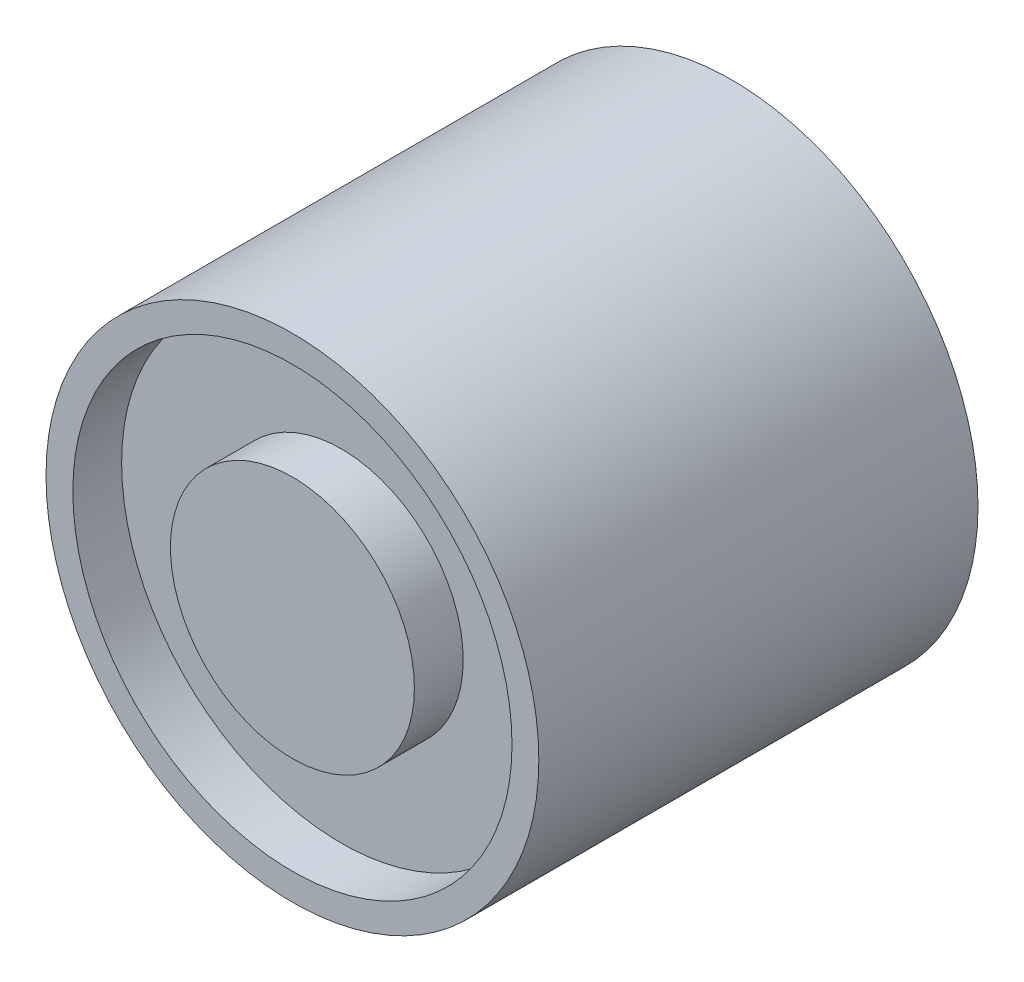
ISO-10303-21;
HEADER;
FILE_DESCRIPTION(('STEP AP214'),'2;1');
FILE_NAME('part.step','',(''),(''),'','','');
FILE_SCHEMA(('AUTOMOTIVE_DESIGN { 1 0 10303 214 1 1 1 1 }'));
ENDSEC;
DATA;
#1=APPLICATION_CONTEXT('core data for automotive mechanical design processes');
#2=APPLICATION_PROTOCOL_DEFINITION('international standard','automotive_design',2000,#1);
#3=PRODUCT_CONTEXT('',#1,'mechanical');
#4=PRODUCT('Part','Part','',(#3));
#5=PRODUCT_RELATED_PRODUCT_CATEGORY('part','',(#4));
#6=PRODUCT_DEFINITION_FORMATION('','',#4);
#7=PRODUCT_DEFINITION_CONTEXT('part definition',#1,'design');
#8=PRODUCT_DEFINITION('design','',#6,#7);
#9=PRODUCT_DEFINITION_SHAPE('','',#8);
#10=(LENGTH_UNIT() NAMED_UNIT(*) SI_UNIT(.MILLI.,.METRE.));
#11=(NAMED_UNIT(*) PLANE_ANGLE_UNIT() SI_UNIT($,.RADIAN.));
#12=(NAMED_UNIT(*) SI_UNIT($,.STERADIAN.) SOLID_ANGLE_UNIT());
#13=UNCERTAINTY_MEASURE_WITH_UNIT(LENGTH_MEASURE(1.E-05),#10,'distance_accuracy_value','');
#14=(GEOMETRIC_REPRESENTATION_CONTEXT(3) GLOBAL_UNCERTAINTY_ASSIGNED_CONTEXT((#13)) GLOBAL_UNIT_ASSIGNED_CONTEXT((#10,
#11,#12)) REPRESENTATION_CONTEXT('',''));
#15=CARTESIAN_POINT('',(0.,0.,0.));
#16=DIRECTION('',(0.,0.,1.));
#17=DIRECTION('',(1.,0.,0.));
#18=AXIS2_PLACEMENT_3D('',#15,#16,#17);
#19=CARTESIAN_POINT('',(0.,0.,20.32));
#20=DIRECTION('',(0.,0.,-1.));
#21=DIRECTION('',(-1.,0.,0.));
#22=AXIS2_PLACEMENT_3D('',#19,#20,#21);
#23=CYLINDRICAL_SURFACE('',#22,12.827);
#24=CARTESIAN_POINT('',(0.,0.,0.));
#25=DIRECTION('',(0.,0.,1.));
#26=DIRECTION('',(1.,0.,0.));
#27=AXIS2_PLACEMENT_3D('',#24,#25,#26);
#28=CIRCLE('',#27,12.827);
#29=CARTESIAN_POINT('',(12.827,0.,0.));
#30=VERTEX_POINT('',#29);
#31=EDGE_CURVE('E64',#30,#30,#28,.T.);
#32=ORIENTED_EDGE('',*,*,#31,.T.);
#33=EDGE_LOOP('',(#32));
#34=FACE_BOUND('',#33,.T.);
#35=CARTESIAN_POINT('',(0.,0.,22.86));
#36=DIRECTION('',(0.,0.,1.));
#37=DIRECTION('',(1.,0.,0.));
#38=AXIS2_PLACEMENT_3D('',#35,#36,#37);
#39=CIRCLE('',#38,12.827);
#40=CARTESIAN_POINT('',(12.827,0.,22.86));
#41=VERTEX_POINT('',#40);
#42=EDGE_CURVE('E69',#41,#41,#39,.T.);
#43=ORIENTED_EDGE('',*,*,#42,.F.);
#44=EDGE_LOOP('',(#43));
#45=FACE_BOUND('',#44,.T.);
#46=ADVANCED_FACE('F57',(#34,#45),#23,.T.);
#47=CARTESIAN_POINT('',(0.,0.,0.));
#48=DIRECTION('',(0.,0.,1.));
#49=DIRECTION('',(1.,0.,0.));
#50=AXIS2_PLACEMENT_3D('',#47,#48,#49);
#51=PLANE('',#50);
#52=ORIENTED_EDGE('',*,*,#31,.F.);
#53=EDGE_LOOP('',(#52));
#54=FACE_BOUND('',#53,.T.);
#55=ADVANCED_FACE('F110',(#54),#51,.F.);
#56=CARTESIAN_POINT('',(0.,0.,22.86));
#57=DIRECTION('',(0.,0.,-1.));
#58=DIRECTION('',(-1.,0.,0.));
#59=AXIS2_PLACEMENT_3D('',#56,#57,#58);
#60=CYLINDRICAL_SURFACE('',#59,11.43);
#61=CARTESIAN_POINT('',(0.,0.,22.86));
#62=DIRECTION('',(0.,0.,1.));
#63=DIRECTION('',(1.,0.,0.));
#64=AXIS2_PLACEMENT_3D('',#61,#62,#63);
#65=CIRCLE('',#64,11.43);
#66=CARTESIAN_POINT('',(11.43,0.,22.86));
#67=VERTEX_POINT('',#66);
#68=EDGE_CURVE('E74',#67,#67,#65,.T.);
#69=ORIENTED_EDGE('',*,*,#68,.T.);
#70=EDGE_LOOP('',(#69));
#71=FACE_BOUND('',#70,.T.);
#72=CARTESIAN_POINT('',(0.,0.,20.32));
#73=DIRECTION('',(0.,0.,1.));
#74=DIRECTION('',(1.,0.,0.));
#75=AXIS2_PLACEMENT_3D('',#72,#73,#74);
#76=CIRCLE('',#75,11.43);
#77=CARTESIAN_POINT('',(11.43,0.,20.32));
#78=VERTEX_POINT('',#77);
#79=EDGE_CURVE('E11',#78,#78,#76,.F.);
#80=ORIENTED_EDGE('',*,*,#79,.T.);
#81=EDGE_LOOP('',(#80));
#82=FACE_BOUND('',#81,.T.);
#83=ADVANCED_FACE('F105',(#71,#82),#60,.F.);
#84=CARTESIAN_POINT('',(0.,0.,22.86));
#85=DIRECTION('',(0.,0.,1.));
#86=DIRECTION('',(1.,0.,0.));
#87=AXIS2_PLACEMENT_3D('',#84,#85,#86);
#88=PLANE('',#87);
#89=ORIENTED_EDGE('',*,*,#68,.F.);
#90=EDGE_LOOP('',(#89));
#91=FACE_BOUND('',#90,.T.);
#92=ORIENTED_EDGE('',*,*,#42,.T.);
#93=EDGE_LOOP('',(#92));
#94=FACE_BOUND('',#93,.T.);
#95=ADVANCED_FACE('F100',(#91,#94),#88,.T.);
#96=CARTESIAN_POINT('',(0.,0.,20.32));
#97=DIRECTION('',(0.,0.,1.));
#98=DIRECTION('',(1.,0.,0.));
#99=AXIS2_PLACEMENT_3D('',#96,#97,#98);
#100=PLANE('',#99);
#101=CARTESIAN_POINT('',(0.,0.,20.32));
#102=DIRECTION('',(0.,0.,1.));
#103=DIRECTION('',(1.,0.,0.));
#104=AXIS2_PLACEMENT_3D('',#101,#102,#103);
#105=CIRCLE('',#104,6.35);
#106=CARTESIAN_POINT('',(6.35,0.,20.32));
#107=VERTEX_POINT('',#106);
#108=EDGE_CURVE('E81',#107,#107,#105,.T.);
#109=ORIENTED_EDGE('',*,*,#108,.F.);
#110=EDGE_LOOP('',(#109));
#111=FACE_BOUND('',#110,.T.);
#112=ORIENTED_EDGE('',*,*,#79,.F.);
#113=EDGE_LOOP('',(#112));
#114=FACE_BOUND('',#113,.T.);
#115=ADVANCED_FACE('F94',(#111,#114),#100,.T.);
#116=CARTESIAN_POINT('',(0.,0.,22.86));
#117=DIRECTION('',(0.,0.,-1.));
#118=DIRECTION('',(-1.,0.,0.));
#119=AXIS2_PLACEMENT_3D('',#116,#117,#118);
#120=CYLINDRICAL_SURFACE('',#119,6.35);
#121=CARTESIAN_POINT('',(0.,0.,22.86));
#122=DIRECTION('',(0.,0.,1.));
#123=DIRECTION('',(1.,0.,0.));
#124=AXIS2_PLACEMENT_3D('',#121,#122,#123);
#125=CIRCLE('',#124,6.35);
#126=CARTESIAN_POINT('',(6.35,0.,22.86));
#127=VERTEX_POINT('',#126);
#128=EDGE_CURVE('E80',#127,#127,#125,.T.);
#129=ORIENTED_EDGE('',*,*,#128,.F.);
#130=EDGE_LOOP('',(#129));
#131=FACE_BOUND('',#130,.T.);
#132=ORIENTED_EDGE('',*,*,#108,.T.);
#133=EDGE_LOOP('',(#132));
#134=FACE_BOUND('',#133,.T.);
#135=ADVANCED_FACE('F91',(#131,#134),#120,.T.);
#136=CARTESIAN_POINT('',(0.,0.,22.86));
#137=DIRECTION('',(0.,0.,1.));
#138=DIRECTION('',(1.,0.,0.));
#139=AXIS2_PLACEMENT_3D('',#136,#137,#138);
#140=PLANE('',#139);
#141=ORIENTED_EDGE('',*,*,#128,.T.);
#142=EDGE_LOOP('',(#141));
#143=FACE_BOUND('',#142,.T.);
#144=ADVANCED_FACE('F89',(#143),#140,.T.);
#145=CLOSED_SHELL('',(#46,#55,#83,#95,#115,#135,#144));
#146=MANIFOLD_SOLID_BREP('B2',#145);
#147=ADVANCED_BREP_SHAPE_REPRESENTATION('',(#18,#146),#14);
#148=SHAPE_DEFINITION_REPRESENTATION(#9,#147);
ENDSEC;
END-ISO-10303-21;
